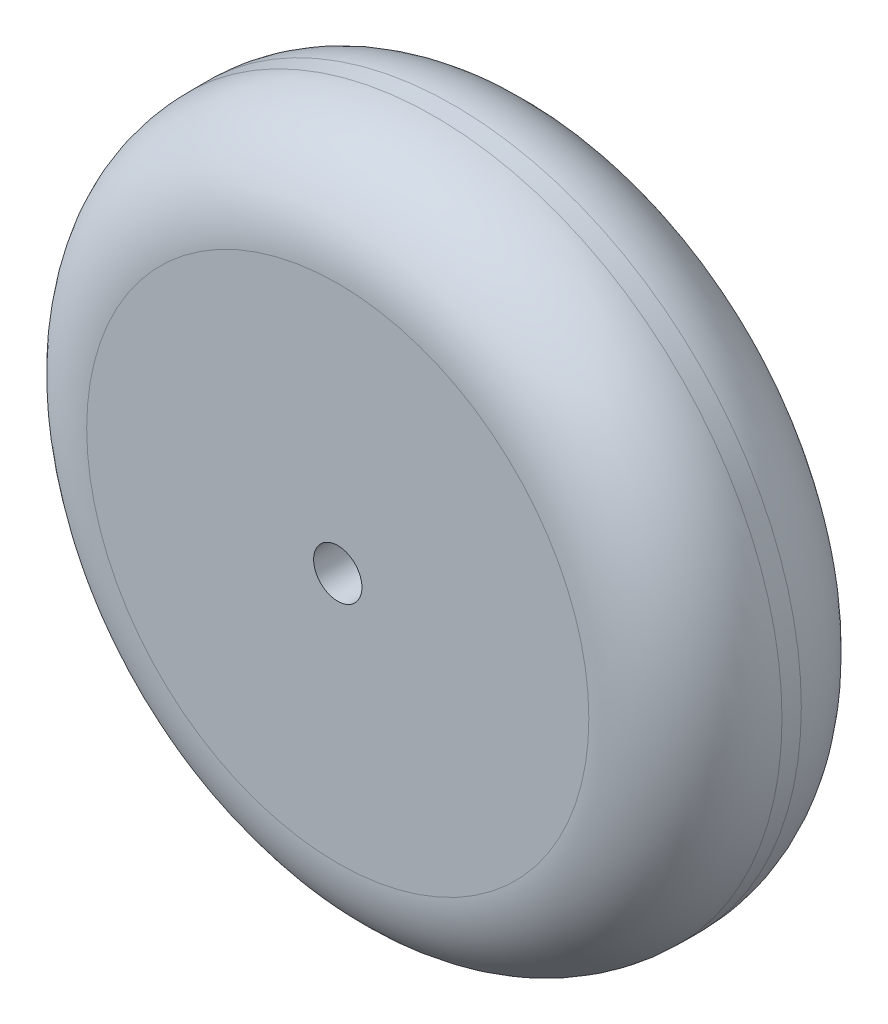
ISO-10303-21;
HEADER;
FILE_DESCRIPTION(('STEP AP214'),'2;1');
FILE_NAME('part.step','',(''),(''),'','','');
FILE_SCHEMA(('AUTOMOTIVE_DESIGN { 1 0 10303 214 1 1 1 1 }'));
ENDSEC;
DATA;
#1=APPLICATION_CONTEXT('core data for automotive mechanical design processes');
#2=APPLICATION_PROTOCOL_DEFINITION('international standard','automotive_design',2000,#1);
#3=PRODUCT_CONTEXT('',#1,'mechanical');
#4=PRODUCT('Part','Part','',(#3));
#5=PRODUCT_RELATED_PRODUCT_CATEGORY('part','',(#4));
#6=PRODUCT_DEFINITION_FORMATION('','',#4);
#7=PRODUCT_DEFINITION_CONTEXT('part definition',#1,'design');
#8=PRODUCT_DEFINITION('design','',#6,#7);
#9=PRODUCT_DEFINITION_SHAPE('','',#8);
#10=(LENGTH_UNIT() NAMED_UNIT(*) SI_UNIT(.MILLI.,.METRE.));
#11=(NAMED_UNIT(*) PLANE_ANGLE_UNIT() SI_UNIT($,.RADIAN.));
#12=(NAMED_UNIT(*) SI_UNIT($,.STERADIAN.) SOLID_ANGLE_UNIT());
#13=UNCERTAINTY_MEASURE_WITH_UNIT(LENGTH_MEASURE(1.E-05),#10,'distance_accuracy_value','');
#14=(GEOMETRIC_REPRESENTATION_CONTEXT(3) GLOBAL_UNCERTAINTY_ASSIGNED_CONTEXT((#13)) GLOBAL_UNIT_ASSIGNED_CONTEXT((#10,
#11,#12)) REPRESENTATION_CONTEXT('',''));
#15=CARTESIAN_POINT('',(0.,0.,0.));
#16=DIRECTION('',(0.,0.,1.));
#17=DIRECTION('',(1.,0.,0.));
#18=AXIS2_PLACEMENT_3D('',#15,#16,#17);
#19=CARTESIAN_POINT('',(0.,0.,22.));
#20=DIRECTION('',(0.,0.,-1.));
#21=DIRECTION('',(-1.,0.,0.));
#22=AXIS2_PLACEMENT_3D('',#19,#20,#21);
#23=CYLINDRICAL_SURFACE('',#22,36.);
#24=CARTESIAN_POINT('',(0.,0.,10.));
#25=DIRECTION('',(0.,0.,1.));
#26=DIRECTION('',(1.,0.,0.));
#27=AXIS2_PLACEMENT_3D('',#24,#25,#26);
#28=CIRCLE('',#27,36.);
#29=CARTESIAN_POINT('',(36.,0.,10.));
#30=VERTEX_POINT('',#29);
#31=EDGE_CURVE('E53',#30,#30,#28,.T.);
#32=ORIENTED_EDGE('',*,*,#31,.T.);
#33=EDGE_LOOP('',(#32));
#34=FACE_BOUND('',#33,.T.);
#35=CARTESIAN_POINT('',(0.,0.,12.));
#36=DIRECTION('',(0.,0.,1.));
#37=DIRECTION('',(1.,0.,0.));
#38=AXIS2_PLACEMENT_3D('',#35,#36,#37);
#39=CIRCLE('',#38,36.);
#40=CARTESIAN_POINT('',(36.,0.,12.));
#41=VERTEX_POINT('',#40);
#42=EDGE_CURVE('E57',#41,#41,#39,.F.);
#43=ORIENTED_EDGE('',*,*,#42,.T.);
#44=EDGE_LOOP('',(#43));
#45=FACE_BOUND('',#44,.T.);
#46=ADVANCED_FACE('F42',(#34,#45),#23,.T.);
#47=CARTESIAN_POINT('',(0.,0.,22.));
#48=DIRECTION('',(0.,0.,1.));
#49=DIRECTION('',(1.,0.,0.));
#50=AXIS2_PLACEMENT_3D('',#47,#48,#49);
#51=PLANE('',#50);
#52=CARTESIAN_POINT('',(0.,0.,22.));
#53=DIRECTION('',(0.,0.,1.));
#54=DIRECTION('',(1.,0.,0.));
#55=AXIS2_PLACEMENT_3D('',#52,#53,#54);
#56=CIRCLE('',#55,26.);
#57=CARTESIAN_POINT('',(26.,0.,22.));
#58=VERTEX_POINT('',#57);
#59=EDGE_CURVE('E12',#58,#58,#56,.T.);
#60=ORIENTED_EDGE('',*,*,#59,.T.);
#61=EDGE_LOOP('',(#60));
#62=FACE_BOUND('',#61,.T.);
#63=CARTESIAN_POINT('',(0.,0.,22.));
#64=DIRECTION('',(0.,0.,1.));
#65=DIRECTION('',(1.,0.,0.));
#66=AXIS2_PLACEMENT_3D('',#63,#64,#65);
#67=CIRCLE('',#66,2.5);
#68=CARTESIAN_POINT('',(2.5,0.,22.));
#69=VERTEX_POINT('',#68);
#70=EDGE_CURVE('E63',#69,#69,#67,.T.);
#71=ORIENTED_EDGE('',*,*,#70,.F.);
#72=EDGE_LOOP('',(#71));
#73=FACE_BOUND('',#72,.T.);
#74=ADVANCED_FACE('F78',(#62,#73),#51,.T.);
#75=CARTESIAN_POINT('',(0.,0.,0.));
#76=DIRECTION('',(0.,0.,1.));
#77=DIRECTION('',(1.,0.,0.));
#78=AXIS2_PLACEMENT_3D('',#75,#76,#77);
#79=PLANE('',#78);
#80=CARTESIAN_POINT('',(0.,0.,0.));
#81=DIRECTION('',(0.,0.,1.));
#82=DIRECTION('',(1.,0.,0.));
#83=AXIS2_PLACEMENT_3D('',#80,#81,#82);
#84=CIRCLE('',#83,26.);
#85=CARTESIAN_POINT('',(26.,0.,0.));
#86=VERTEX_POINT('',#85);
#87=EDGE_CURVE('E49',#86,#86,#84,.F.);
#88=ORIENTED_EDGE('',*,*,#87,.T.);
#89=EDGE_LOOP('',(#88));
#90=FACE_BOUND('',#89,.T.);
#91=CARTESIAN_POINT('',(0.,0.,0.));
#92=DIRECTION('',(0.,0.,1.));
#93=DIRECTION('',(1.,0.,0.));
#94=AXIS2_PLACEMENT_3D('',#91,#92,#93);
#95=CIRCLE('',#94,2.5);
#96=CARTESIAN_POINT('',(2.5,0.,0.));
#97=VERTEX_POINT('',#96);
#98=EDGE_CURVE('E62',#97,#97,#95,.T.);
#99=ORIENTED_EDGE('',*,*,#98,.T.);
#100=EDGE_LOOP('',(#99));
#101=FACE_BOUND('',#100,.T.);
#102=ADVANCED_FACE('F69',(#90,#101),#79,.F.);
#103=CARTESIAN_POINT('',(0.,0.,0.));
#104=DIRECTION('',(0.,0.,1.));
#105=DIRECTION('',(1.,0.,0.));
#106=AXIS2_PLACEMENT_3D('',#103,#104,#105);
#107=CYLINDRICAL_SURFACE('',#106,2.5);
#108=ORIENTED_EDGE('',*,*,#98,.F.);
#109=EDGE_LOOP('',(#108));
#110=FACE_BOUND('',#109,.T.);
#111=ORIENTED_EDGE('',*,*,#70,.T.);
#112=EDGE_LOOP('',(#111));
#113=FACE_BOUND('',#112,.T.);
#114=ADVANCED_FACE('F71',(#110,#113),#107,.F.);
#115=CARTESIAN_POINT('',(0.,0.,10.));
#116=DIRECTION('',(0.,0.,1.));
#117=DIRECTION('',(1.,0.,0.));
#118=AXIS2_PLACEMENT_3D('',#115,#116,#117);
#119=TOROIDAL_SURFACE('',#118,26.,10.);
#120=ORIENTED_EDGE('',*,*,#87,.F.);
#121=EDGE_LOOP('',(#120));
#122=FACE_BOUND('',#121,.T.);
#123=ORIENTED_EDGE('',*,*,#31,.F.);
#124=EDGE_LOOP('',(#123));
#125=FACE_BOUND('',#124,.T.);
#126=ADVANCED_FACE('F74',(#122,#125),#119,.T.);
#127=CARTESIAN_POINT('',(0.,0.,12.));
#128=DIRECTION('',(0.,0.,1.));
#129=DIRECTION('',(1.,0.,0.));
#130=AXIS2_PLACEMENT_3D('',#127,#128,#129);
#131=TOROIDAL_SURFACE('',#130,26.,10.);
#132=ORIENTED_EDGE('',*,*,#42,.F.);
#133=EDGE_LOOP('',(#132));
#134=FACE_BOUND('',#133,.T.);
#135=ORIENTED_EDGE('',*,*,#59,.F.);
#136=EDGE_LOOP('',(#135));
#137=FACE_BOUND('',#136,.T.);
#138=ADVANCED_FACE('F44',(#134,#137),#131,.T.);
#139=CLOSED_SHELL('',(#46,#74,#102,#114,#126,#138));
#140=MANIFOLD_SOLID_BREP('B2',#139);
#141=ADVANCED_BREP_SHAPE_REPRESENTATION('',(#18,#140),#14);
#142=SHAPE_DEFINITION_REPRESENTATION(#9,#141);
ENDSEC;
END-ISO-10303-21;
